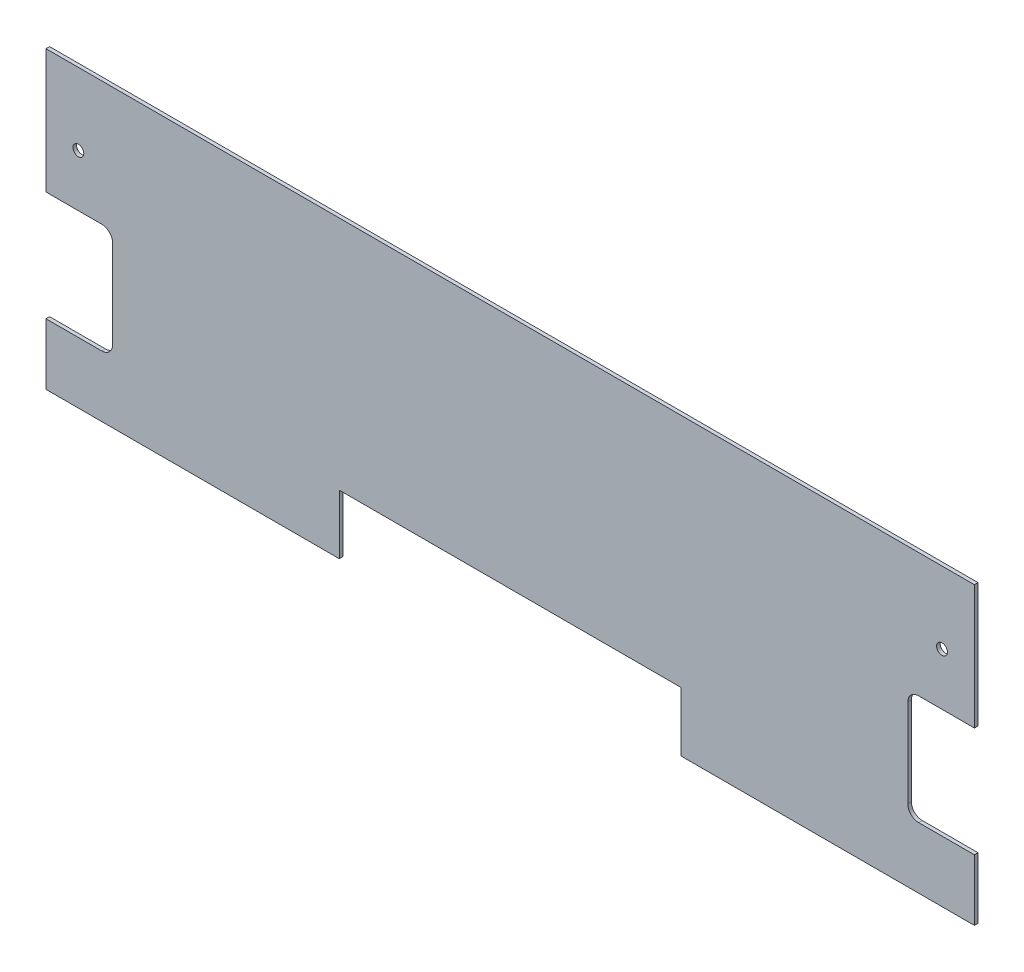
ISO-10303-21;
HEADER;
FILE_DESCRIPTION(('STEP AP214'),'2;1');
FILE_NAME('part.step','',(''),(''),'','','');
FILE_SCHEMA(('AUTOMOTIVE_DESIGN { 1 0 10303 214 1 1 1 1 }'));
ENDSEC;
DATA;
#1=APPLICATION_CONTEXT('core data for automotive mechanical design processes');
#2=APPLICATION_PROTOCOL_DEFINITION('international standard','automotive_design',2000,#1);
#3=PRODUCT_CONTEXT('',#1,'mechanical');
#4=PRODUCT('Part','Part','',(#3));
#5=PRODUCT_RELATED_PRODUCT_CATEGORY('part','',(#4));
#6=PRODUCT_DEFINITION_FORMATION('','',#4);
#7=PRODUCT_DEFINITION_CONTEXT('part definition',#1,'design');
#8=PRODUCT_DEFINITION('design','',#6,#7);
#9=PRODUCT_DEFINITION_SHAPE('','',#8);
#10=(LENGTH_UNIT() NAMED_UNIT(*) SI_UNIT(.MILLI.,.METRE.));
#11=(NAMED_UNIT(*) PLANE_ANGLE_UNIT() SI_UNIT($,.RADIAN.));
#12=(NAMED_UNIT(*) SI_UNIT($,.STERADIAN.) SOLID_ANGLE_UNIT());
#13=UNCERTAINTY_MEASURE_WITH_UNIT(LENGTH_MEASURE(1.E-05),#10,'distance_accuracy_value','');
#14=(GEOMETRIC_REPRESENTATION_CONTEXT(3) GLOBAL_UNCERTAINTY_ASSIGNED_CONTEXT((#13)) GLOBAL_UNIT_ASSIGNED_CONTEXT((#10,
#11,#12)) REPRESENTATION_CONTEXT('',''));
#15=CARTESIAN_POINT('',(0.,0.,0.));
#16=DIRECTION('',(0.,0.,1.));
#17=DIRECTION('',(1.,0.,0.));
#18=AXIS2_PLACEMENT_3D('',#15,#16,#17);
#19=CARTESIAN_POINT('',(-129.,-82.,-1.));
#20=DIRECTION('',(-1.,0.,0.));
#21=DIRECTION('',(0.,0.,1.));
#22=AXIS2_PLACEMENT_3D('',#19,#20,#21);
#23=PLANE('',#22);
#24=DIRECTION('',(0.,0.,1.));
#25=VECTOR('',#24,1.);
#26=CARTESIAN_POINT('',(-129.,-34.5,-1.));
#27=LINE('',#26,#25);
#28=CARTESIAN_POINT('',(-129.,-34.5,-1.));
#29=VERTEX_POINT('',#28);
#30=CARTESIAN_POINT('',(-129.,-34.5,0.));
#31=VERTEX_POINT('',#30);
#32=EDGE_CURVE('E303',#29,#31,#27,.T.);
#33=ORIENTED_EDGE('',*,*,#32,.T.);
#34=DIRECTION('',(0.,-1.,0.));
#35=VECTOR('',#34,1.);
#36=CARTESIAN_POINT('',(-129.,-82.,0.));
#37=LINE('',#36,#35);
#38=CARTESIAN_POINT('',(-129.,0.,0.));
#39=VERTEX_POINT('',#38);
#40=EDGE_CURVE('E214',#39,#31,#37,.T.);
#41=ORIENTED_EDGE('',*,*,#40,.F.);
#42=DIRECTION('',(0.,0.,1.));
#43=VECTOR('',#42,1.);
#44=CARTESIAN_POINT('',(-129.,0.,-1.));
#45=LINE('',#44,#43);
#46=CARTESIAN_POINT('',(-129.,0.,-1.));
#47=VERTEX_POINT('',#46);
#48=EDGE_CURVE('E240',#47,#39,#45,.T.);
#49=ORIENTED_EDGE('',*,*,#48,.F.);
#50=DIRECTION('',(0.,-1.,0.));
#51=VECTOR('',#50,1.);
#52=CARTESIAN_POINT('',(-129.,-82.,-1.));
#53=LINE('',#52,#51);
#54=EDGE_CURVE('E317',#47,#29,#53,.T.);
#55=ORIENTED_EDGE('',*,*,#54,.T.);
#56=EDGE_LOOP('',(#33,#41,#49,#55));
#57=FACE_BOUND('',#56,.T.);
#58=ADVANCED_FACE('F38',(#57),#23,.T.);
#59=CARTESIAN_POINT('',(129.,-82.,-1.));
#60=DIRECTION('',(1.,0.,0.));
#61=DIRECTION('',(0.,0.,-1.));
#62=AXIS2_PLACEMENT_3D('',#59,#60,#61);
#63=PLANE('',#62);
#64=DIRECTION('',(0.,0.,1.));
#65=VECTOR('',#64,1.);
#66=CARTESIAN_POINT('',(129.,-65.,-1.));
#67=LINE('',#66,#65);
#68=CARTESIAN_POINT('',(129.,-65.,-1.));
#69=VERTEX_POINT('',#68);
#70=CARTESIAN_POINT('',(129.,-65.,0.));
#71=VERTEX_POINT('',#70);
#72=EDGE_CURVE('E193',#69,#71,#67,.T.);
#73=ORIENTED_EDGE('',*,*,#72,.T.);
#74=DIRECTION('',(0.,1.,0.));
#75=VECTOR('',#74,1.);
#76=CARTESIAN_POINT('',(129.,-82.,0.));
#77=LINE('',#76,#75);
#78=CARTESIAN_POINT('',(129.,-82.,0.));
#79=VERTEX_POINT('',#78);
#80=EDGE_CURVE('E233',#79,#71,#77,.T.);
#81=ORIENTED_EDGE('',*,*,#80,.F.);
#82=DIRECTION('',(0.,0.,1.));
#83=VECTOR('',#82,1.);
#84=CARTESIAN_POINT('',(129.,-82.,-1.));
#85=LINE('',#84,#83);
#86=CARTESIAN_POINT('',(129.,-82.,-1.));
#87=VERTEX_POINT('',#86);
#88=EDGE_CURVE('E245',#87,#79,#85,.T.);
#89=ORIENTED_EDGE('',*,*,#88,.F.);
#90=DIRECTION('',(0.,1.,0.));
#91=VECTOR('',#90,1.);
#92=CARTESIAN_POINT('',(129.,-82.,-1.));
#93=LINE('',#92,#91);
#94=EDGE_CURVE('E203',#87,#69,#93,.T.);
#95=ORIENTED_EDGE('',*,*,#94,.T.);
#96=EDGE_LOOP('',(#73,#81,#89,#95));
#97=FACE_BOUND('',#96,.T.);
#98=ADVANCED_FACE('F374',(#97),#63,.T.);
#99=DIRECTION('',(0.,0.,1.));
#100=VECTOR('',#99,1.);
#101=CARTESIAN_POINT('',(-129.,-65.,-1.));
#102=LINE('',#101,#100);
#103=CARTESIAN_POINT('',(-129.,-65.,-1.));
#104=VERTEX_POINT('',#103);
#105=CARTESIAN_POINT('',(-129.,-65.,0.));
#106=VERTEX_POINT('',#105);
#107=EDGE_CURVE('E305',#104,#106,#102,.T.);
#108=ORIENTED_EDGE('',*,*,#107,.F.);
#109=CARTESIAN_POINT('',(-129.,-82.,-1.));
#110=VERTEX_POINT('',#109);
#111=EDGE_CURVE('E239',#104,#110,#53,.T.);
#112=ORIENTED_EDGE('',*,*,#111,.T.);
#113=DIRECTION('',(0.,0.,1.));
#114=VECTOR('',#113,1.);
#115=CARTESIAN_POINT('',(-129.,-82.,-1.));
#116=LINE('',#115,#114);
#117=CARTESIAN_POINT('',(-129.,-82.,0.));
#118=VERTEX_POINT('',#117);
#119=EDGE_CURVE('E213',#110,#118,#116,.T.);
#120=ORIENTED_EDGE('',*,*,#119,.T.);
#121=EDGE_CURVE('E218',#106,#118,#37,.T.);
#122=ORIENTED_EDGE('',*,*,#121,.F.);
#123=EDGE_LOOP('',(#108,#112,#120,#122));
#124=FACE_BOUND('',#123,.T.);
#125=ADVANCED_FACE('F352',(#124),#23,.T.);
#126=CARTESIAN_POINT('',(-129.,0.,-1.));
#127=DIRECTION('',(0.,1.,0.));
#128=DIRECTION('',(0.,0.,1.));
#129=AXIS2_PLACEMENT_3D('',#126,#127,#128);
#130=PLANE('',#129);
#131=DIRECTION('',(-1.,0.,0.));
#132=VECTOR('',#131,1.);
#133=CARTESIAN_POINT('',(-129.,0.,0.));
#134=LINE('',#133,#132);
#135=CARTESIAN_POINT('',(129.,0.,0.));
#136=VERTEX_POINT('',#135);
#137=EDGE_CURVE('E236',#136,#39,#134,.T.);
#138=ORIENTED_EDGE('',*,*,#137,.F.);
#139=DIRECTION('',(0.,0.,1.));
#140=VECTOR('',#139,1.);
#141=CARTESIAN_POINT('',(129.,0.,-1.));
#142=LINE('',#141,#140);
#143=CARTESIAN_POINT('',(129.,0.,-1.));
#144=VERTEX_POINT('',#143);
#145=EDGE_CURVE('E243',#144,#136,#142,.T.);
#146=ORIENTED_EDGE('',*,*,#145,.F.);
#147=DIRECTION('',(-1.,0.,0.));
#148=VECTOR('',#147,1.);
#149=CARTESIAN_POINT('',(-129.,0.,-1.));
#150=LINE('',#149,#148);
#151=EDGE_CURVE('E202',#144,#47,#150,.T.);
#152=ORIENTED_EDGE('',*,*,#151,.T.);
#153=ORIENTED_EDGE('',*,*,#48,.T.);
#154=EDGE_LOOP('',(#138,#146,#152,#153));
#155=FACE_BOUND('',#154,.T.);
#156=ADVANCED_FACE('F385',(#155),#130,.T.);
#157=DIRECTION('',(0.,0.,1.));
#158=VECTOR('',#157,1.);
#159=CARTESIAN_POINT('',(129.,-34.5,-1.));
#160=LINE('',#159,#158);
#161=CARTESIAN_POINT('',(129.,-34.5,-1.));
#162=VERTEX_POINT('',#161);
#163=CARTESIAN_POINT('',(129.,-34.5,0.));
#164=VERTEX_POINT('',#163);
#165=EDGE_CURVE('E177',#162,#164,#160,.T.);
#166=ORIENTED_EDGE('',*,*,#165,.F.);
#167=EDGE_CURVE('E190',#162,#144,#93,.T.);
#168=ORIENTED_EDGE('',*,*,#167,.T.);
#169=ORIENTED_EDGE('',*,*,#145,.T.);
#170=EDGE_CURVE('E192',#164,#136,#77,.T.);
#171=ORIENTED_EDGE('',*,*,#170,.F.);
#172=EDGE_LOOP('',(#166,#168,#169,#171));
#173=FACE_BOUND('',#172,.T.);
#174=ADVANCED_FACE('F188',(#173),#63,.T.);
#175=CARTESIAN_POINT('',(47.5,-82.,-1.));
#176=DIRECTION('',(0.,-1.,0.));
#177=DIRECTION('',(0.,0.,-1.));
#178=AXIS2_PLACEMENT_3D('',#175,#176,#177);
#179=PLANE('',#178);
#180=DIRECTION('',(1.,0.,0.));
#181=VECTOR('',#180,1.);
#182=CARTESIAN_POINT('',(47.5,-82.,0.));
#183=LINE('',#182,#181);
#184=CARTESIAN_POINT('',(47.5,-82.,0.));
#185=VERTEX_POINT('',#184);
#186=EDGE_CURVE('E230',#185,#79,#183,.T.);
#187=ORIENTED_EDGE('',*,*,#186,.F.);
#188=DIRECTION('',(0.,0.,1.));
#189=VECTOR('',#188,1.);
#190=CARTESIAN_POINT('',(47.5,-82.,-1.));
#191=LINE('',#190,#189);
#192=CARTESIAN_POINT('',(47.5,-82.,-1.));
#193=VERTEX_POINT('',#192);
#194=EDGE_CURVE('E247',#193,#185,#191,.T.);
#195=ORIENTED_EDGE('',*,*,#194,.F.);
#196=DIRECTION('',(1.,0.,0.));
#197=VECTOR('',#196,1.);
#198=CARTESIAN_POINT('',(47.5,-82.,-1.));
#199=LINE('',#198,#197);
#200=EDGE_CURVE('E204',#193,#87,#199,.T.);
#201=ORIENTED_EDGE('',*,*,#200,.T.);
#202=ORIENTED_EDGE('',*,*,#88,.T.);
#203=EDGE_LOOP('',(#187,#195,#201,#202));
#204=FACE_BOUND('',#203,.T.);
#205=ADVANCED_FACE('F394',(#204),#179,.T.);
#206=CARTESIAN_POINT('',(47.5,-82.,-1.));
#207=DIRECTION('',(-1.,0.,0.));
#208=DIRECTION('',(0.,0.,1.));
#209=AXIS2_PLACEMENT_3D('',#206,#207,#208);
#210=PLANE('',#209);
#211=DIRECTION('',(0.,-1.,0.));
#212=VECTOR('',#211,1.);
#213=CARTESIAN_POINT('',(47.5,-82.,0.));
#214=LINE('',#213,#212);
#215=CARTESIAN_POINT('',(47.5,-65.5,0.));
#216=VERTEX_POINT('',#215);
#217=EDGE_CURVE('E227',#216,#185,#214,.T.);
#218=ORIENTED_EDGE('',*,*,#217,.F.);
#219=DIRECTION('',(0.,0.,1.));
#220=VECTOR('',#219,1.);
#221=CARTESIAN_POINT('',(47.5,-65.5,-1.));
#222=LINE('',#221,#220);
#223=CARTESIAN_POINT('',(47.5,-65.5,-1.));
#224=VERTEX_POINT('',#223);
#225=EDGE_CURVE('E249',#224,#216,#222,.T.);
#226=ORIENTED_EDGE('',*,*,#225,.F.);
#227=DIRECTION('',(0.,-1.,0.));
#228=VECTOR('',#227,1.);
#229=CARTESIAN_POINT('',(47.5,-82.,-1.));
#230=LINE('',#229,#228);
#231=EDGE_CURVE('E208',#224,#193,#230,.T.);
#232=ORIENTED_EDGE('',*,*,#231,.T.);
#233=ORIENTED_EDGE('',*,*,#194,.T.);
#234=EDGE_LOOP('',(#218,#226,#232,#233));
#235=FACE_BOUND('',#234,.T.);
#236=ADVANCED_FACE('F331',(#235),#210,.T.);
#237=CARTESIAN_POINT('',(-47.5,-65.5,-1.));
#238=DIRECTION('',(0.,-1.,0.));
#239=DIRECTION('',(0.,0.,-1.));
#240=AXIS2_PLACEMENT_3D('',#237,#238,#239);
#241=PLANE('',#240);
#242=DIRECTION('',(1.,0.,0.));
#243=VECTOR('',#242,1.);
#244=CARTESIAN_POINT('',(-47.5,-65.5,0.));
#245=LINE('',#244,#243);
#246=CARTESIAN_POINT('',(-47.5,-65.5,0.));
#247=VERTEX_POINT('',#246);
#248=EDGE_CURVE('E224',#247,#216,#245,.T.);
#249=ORIENTED_EDGE('',*,*,#248,.F.);
#250=DIRECTION('',(0.,0.,1.));
#251=VECTOR('',#250,1.);
#252=CARTESIAN_POINT('',(-47.5,-65.5,-1.));
#253=LINE('',#252,#251);
#254=CARTESIAN_POINT('',(-47.5,-65.5,-1.));
#255=VERTEX_POINT('',#254);
#256=EDGE_CURVE('E251',#255,#247,#253,.T.);
#257=ORIENTED_EDGE('',*,*,#256,.F.);
#258=DIRECTION('',(1.,0.,0.));
#259=VECTOR('',#258,1.);
#260=CARTESIAN_POINT('',(-47.5,-65.5,-1.));
#261=LINE('',#260,#259);
#262=EDGE_CURVE('E325',#255,#224,#261,.T.);
#263=ORIENTED_EDGE('',*,*,#262,.T.);
#264=ORIENTED_EDGE('',*,*,#225,.T.);
#265=EDGE_LOOP('',(#249,#257,#263,#264));
#266=FACE_BOUND('',#265,.T.);
#267=ADVANCED_FACE('F339',(#266),#241,.T.);
#268=CARTESIAN_POINT('',(-47.5,-82.,-1.));
#269=DIRECTION('',(1.,0.,0.));
#270=DIRECTION('',(0.,0.,-1.));
#271=AXIS2_PLACEMENT_3D('',#268,#269,#270);
#272=PLANE('',#271);
#273=DIRECTION('',(0.,1.,0.));
#274=VECTOR('',#273,1.);
#275=CARTESIAN_POINT('',(-47.5,-82.,0.));
#276=LINE('',#275,#274);
#277=CARTESIAN_POINT('',(-47.5,-82.,0.));
#278=VERTEX_POINT('',#277);
#279=EDGE_CURVE('E221',#278,#247,#276,.T.);
#280=ORIENTED_EDGE('',*,*,#279,.F.);
#281=DIRECTION('',(0.,0.,1.));
#282=VECTOR('',#281,1.);
#283=CARTESIAN_POINT('',(-47.5,-82.,-1.));
#284=LINE('',#283,#282);
#285=CARTESIAN_POINT('',(-47.5,-82.,-1.));
#286=VERTEX_POINT('',#285);
#287=EDGE_CURVE('E253',#286,#278,#284,.T.);
#288=ORIENTED_EDGE('',*,*,#287,.F.);
#289=DIRECTION('',(0.,1.,0.));
#290=VECTOR('',#289,1.);
#291=CARTESIAN_POINT('',(-47.5,-82.,-1.));
#292=LINE('',#291,#290);
#293=EDGE_CURVE('E322',#286,#255,#292,.T.);
#294=ORIENTED_EDGE('',*,*,#293,.T.);
#295=ORIENTED_EDGE('',*,*,#256,.T.);
#296=EDGE_LOOP('',(#280,#288,#294,#295));
#297=FACE_BOUND('',#296,.T.);
#298=ADVANCED_FACE('F342',(#297),#272,.T.);
#299=CARTESIAN_POINT('',(-129.,-82.,-1.));
#300=DIRECTION('',(0.,-1.,0.));
#301=DIRECTION('',(0.,0.,-1.));
#302=AXIS2_PLACEMENT_3D('',#299,#300,#301);
#303=PLANE('',#302);
#304=DIRECTION('',(1.,0.,0.));
#305=VECTOR('',#304,1.);
#306=CARTESIAN_POINT('',(-129.,-82.,0.));
#307=LINE('',#306,#305);
#308=EDGE_CURVE('E217',#118,#278,#307,.T.);
#309=ORIENTED_EDGE('',*,*,#308,.F.);
#310=ORIENTED_EDGE('',*,*,#119,.F.);
#311=DIRECTION('',(1.,0.,0.));
#312=VECTOR('',#311,1.);
#313=CARTESIAN_POINT('',(-129.,-82.,-1.));
#314=LINE('',#313,#312);
#315=EDGE_CURVE('E319',#110,#286,#314,.T.);
#316=ORIENTED_EDGE('',*,*,#315,.T.);
#317=ORIENTED_EDGE('',*,*,#287,.T.);
#318=EDGE_LOOP('',(#309,#310,#316,#317));
#319=FACE_BOUND('',#318,.T.);
#320=ADVANCED_FACE('F348',(#319),#303,.T.);
#321=CARTESIAN_POINT('',(0.,0.,-1.));
#322=DIRECTION('',(0.,0.,-1.));
#323=DIRECTION('',(-1.,0.,0.));
#324=AXIS2_PLACEMENT_3D('',#321,#322,#323);
#325=PLANE('',#324);
#326=DIRECTION('',(0.,-1.,0.));
#327=VECTOR('',#326,1.);
#328=CARTESIAN_POINT('',(110.5,-34.5,-1.));
#329=LINE('',#328,#327);
#330=CARTESIAN_POINT('',(110.5,-37.5,-1.));
#331=VERTEX_POINT('',#330);
#332=CARTESIAN_POINT('',(110.5,-62.,-1.));
#333=VERTEX_POINT('',#332);
#334=EDGE_CURVE('E183',#331,#333,#329,.T.);
#335=ORIENTED_EDGE('',*,*,#334,.T.);
#336=CARTESIAN_POINT('',(113.5,-62.,-1.));
#337=DIRECTION('',(0.,0.,-1.));
#338=DIRECTION('',(-1.,0.,0.));
#339=AXIS2_PLACEMENT_3D('',#336,#337,#338);
#340=CIRCLE('',#339,3.);
#341=CARTESIAN_POINT('',(113.5,-65.,-1.));
#342=VERTEX_POINT('',#341);
#343=EDGE_CURVE('E280',#333,#342,#340,.F.);
#344=ORIENTED_EDGE('',*,*,#343,.T.);
#345=DIRECTION('',(1.,0.,0.));
#346=VECTOR('',#345,1.);
#347=CARTESIAN_POINT('',(129.,-65.,-1.));
#348=LINE('',#347,#346);
#349=EDGE_CURVE('E194',#342,#69,#348,.T.);
#350=ORIENTED_EDGE('',*,*,#349,.T.);
#351=ORIENTED_EDGE('',*,*,#94,.F.);
#352=ORIENTED_EDGE('',*,*,#200,.F.);
#353=ORIENTED_EDGE('',*,*,#231,.F.);
#354=ORIENTED_EDGE('',*,*,#262,.F.);
#355=ORIENTED_EDGE('',*,*,#293,.F.);
#356=ORIENTED_EDGE('',*,*,#315,.F.);
#357=ORIENTED_EDGE('',*,*,#111,.F.);
#358=DIRECTION('',(1.,0.,0.));
#359=VECTOR('',#358,1.);
#360=CARTESIAN_POINT('',(-129.,-65.,-1.));
#361=LINE('',#360,#359);
#362=CARTESIAN_POINT('',(-113.5,-65.,-1.));
#363=VERTEX_POINT('',#362);
#364=EDGE_CURVE('E309',#104,#363,#361,.T.);
#365=ORIENTED_EDGE('',*,*,#364,.T.);
#366=CARTESIAN_POINT('',(-113.5,-62.,-1.));
#367=DIRECTION('',(0.,0.,-1.));
#368=DIRECTION('',(-1.,0.,0.));
#369=AXIS2_PLACEMENT_3D('',#366,#367,#368);
#370=CIRCLE('',#369,3.);
#371=CARTESIAN_POINT('',(-110.5,-62.,-1.));
#372=VERTEX_POINT('',#371);
#373=EDGE_CURVE('E284',#363,#372,#370,.F.);
#374=ORIENTED_EDGE('',*,*,#373,.T.);
#375=DIRECTION('',(0.,1.,0.));
#376=VECTOR('',#375,1.);
#377=CARTESIAN_POINT('',(-110.5,-34.5,-1.));
#378=LINE('',#377,#376);
#379=CARTESIAN_POINT('',(-110.5,-37.5,-1.));
#380=VERTEX_POINT('',#379);
#381=EDGE_CURVE('E306',#372,#380,#378,.T.);
#382=ORIENTED_EDGE('',*,*,#381,.T.);
#383=CARTESIAN_POINT('',(-113.5,-37.5,-1.));
#384=DIRECTION('',(0.,0.,-1.));
#385=DIRECTION('',(-1.,0.,0.));
#386=AXIS2_PLACEMENT_3D('',#383,#384,#385);
#387=CIRCLE('',#386,3.);
#388=CARTESIAN_POINT('',(-113.5,-34.5,-1.));
#389=VERTEX_POINT('',#388);
#390=EDGE_CURVE('E11',#380,#389,#387,.F.);
#391=ORIENTED_EDGE('',*,*,#390,.T.);
#392=DIRECTION('',(-1.,0.,0.));
#393=VECTOR('',#392,1.);
#394=CARTESIAN_POINT('',(-129.,-34.5,-1.));
#395=LINE('',#394,#393);
#396=EDGE_CURVE('E302',#389,#29,#395,.T.);
#397=ORIENTED_EDGE('',*,*,#396,.T.);
#398=ORIENTED_EDGE('',*,*,#54,.F.);
#399=ORIENTED_EDGE('',*,*,#151,.F.);
#400=ORIENTED_EDGE('',*,*,#167,.F.);
#401=DIRECTION('',(-1.,0.,0.));
#402=VECTOR('',#401,1.);
#403=CARTESIAN_POINT('',(129.,-34.5,-1.));
#404=LINE('',#403,#402);
#405=CARTESIAN_POINT('',(113.5,-34.5,-1.));
#406=VERTEX_POINT('',#405);
#407=EDGE_CURVE('E173',#162,#406,#404,.T.);
#408=ORIENTED_EDGE('',*,*,#407,.T.);
#409=CARTESIAN_POINT('',(113.5,-37.5,-1.));
#410=DIRECTION('',(0.,0.,-1.));
#411=DIRECTION('',(-1.,0.,0.));
#412=AXIS2_PLACEMENT_3D('',#409,#410,#411);
#413=CIRCLE('',#412,3.);
#414=EDGE_CURVE('E276',#406,#331,#413,.F.);
#415=ORIENTED_EDGE('',*,*,#414,.T.);
#416=EDGE_LOOP('',(#335,#344,#350,#351,#352,#353,#354,#355,#356,#357,#365,#374,#382,#391,#397,
#398,#399,#400,#408,#415));
#417=FACE_BOUND('',#416,.T.);
#418=CARTESIAN_POINT('',(-120.,-20.,-1.));
#419=DIRECTION('',(0.,0.,1.));
#420=DIRECTION('',(1.,0.,0.));
#421=AXIS2_PLACEMENT_3D('',#418,#419,#420);
#422=CIRCLE('',#421,1.5);
#423=CARTESIAN_POINT('',(-118.5,-20.,-1.));
#424=VERTEX_POINT('',#423);
#425=EDGE_CURVE('E436',#424,#424,#422,.T.);
#426=ORIENTED_EDGE('',*,*,#425,.T.);
#427=EDGE_LOOP('',(#426));
#428=FACE_BOUND('',#427,.T.);
#429=CARTESIAN_POINT('',(120.,-20.,-1.));
#430=DIRECTION('',(0.,0.,1.));
#431=DIRECTION('',(-1.,0.,0.));
#432=AXIS2_PLACEMENT_3D('',#429,#430,#431);
#433=CIRCLE('',#432,1.5);
#434=CARTESIAN_POINT('',(118.5,-20.,-1.));
#435=VERTEX_POINT('',#434);
#436=EDGE_CURVE('E426',#435,#435,#433,.T.);
#437=ORIENTED_EDGE('',*,*,#436,.T.);
#438=EDGE_LOOP('',(#437));
#439=FACE_BOUND('',#438,.T.);
#440=ADVANCED_FACE('F198',(#417,#428,#439),#325,.T.);
#441=CARTESIAN_POINT('',(0.,0.,0.));
#442=DIRECTION('',(0.,0.,-1.));
#443=DIRECTION('',(-1.,0.,0.));
#444=AXIS2_PLACEMENT_3D('',#441,#442,#443);
#445=PLANE('',#444);
#446=CARTESIAN_POINT('',(-120.,-20.,0.));
#447=DIRECTION('',(0.,0.,1.));
#448=DIRECTION('',(1.,0.,0.));
#449=AXIS2_PLACEMENT_3D('',#446,#447,#448);
#450=CIRCLE('',#449,1.5);
#451=CARTESIAN_POINT('',(-118.5,-20.,0.));
#452=VERTEX_POINT('',#451);
#453=EDGE_CURVE('E421',#452,#452,#450,.T.);
#454=ORIENTED_EDGE('',*,*,#453,.F.);
#455=EDGE_LOOP('',(#454));
#456=FACE_BOUND('',#455,.T.);
#457=CARTESIAN_POINT('',(120.,-20.,0.));
#458=DIRECTION('',(0.,0.,1.));
#459=DIRECTION('',(-1.,0.,0.));
#460=AXIS2_PLACEMENT_3D('',#457,#458,#459);
#461=CIRCLE('',#460,1.5);
#462=CARTESIAN_POINT('',(118.5,-20.,0.));
#463=VERTEX_POINT('',#462);
#464=EDGE_CURVE('E424',#463,#463,#461,.T.);
#465=ORIENTED_EDGE('',*,*,#464,.F.);
#466=EDGE_LOOP('',(#465));
#467=FACE_BOUND('',#466,.T.);
#468=ORIENTED_EDGE('',*,*,#80,.T.);
#469=DIRECTION('',(1.,0.,0.));
#470=VECTOR('',#469,1.);
#471=CARTESIAN_POINT('',(129.,-65.,0.));
#472=LINE('',#471,#470);
#473=CARTESIAN_POINT('',(113.5,-65.,0.));
#474=VERTEX_POINT('',#473);
#475=EDGE_CURVE('E184',#474,#71,#472,.T.);
#476=ORIENTED_EDGE('',*,*,#475,.F.);
#477=CARTESIAN_POINT('',(113.5,-62.,0.));
#478=DIRECTION('',(0.,0.,-1.));
#479=DIRECTION('',(-1.,0.,0.));
#480=AXIS2_PLACEMENT_3D('',#477,#478,#479);
#481=CIRCLE('',#480,3.);
#482=CARTESIAN_POINT('',(110.5,-62.,0.));
#483=VERTEX_POINT('',#482);
#484=EDGE_CURVE('E278',#474,#483,#481,.T.);
#485=ORIENTED_EDGE('',*,*,#484,.T.);
#486=DIRECTION('',(0.,-1.,0.));
#487=VECTOR('',#486,1.);
#488=CARTESIAN_POINT('',(110.5,-34.5,0.));
#489=LINE('',#488,#487);
#490=CARTESIAN_POINT('',(110.5,-37.5,0.));
#491=VERTEX_POINT('',#490);
#492=EDGE_CURVE('E435',#491,#483,#489,.T.);
#493=ORIENTED_EDGE('',*,*,#492,.F.);
#494=CARTESIAN_POINT('',(113.5,-37.5,0.));
#495=DIRECTION('',(0.,0.,-1.));
#496=DIRECTION('',(-1.,0.,0.));
#497=AXIS2_PLACEMENT_3D('',#494,#495,#496);
#498=CIRCLE('',#497,3.);
#499=CARTESIAN_POINT('',(113.5,-34.5,0.));
#500=VERTEX_POINT('',#499);
#501=EDGE_CURVE('E274',#491,#500,#498,.T.);
#502=ORIENTED_EDGE('',*,*,#501,.T.);
#503=DIRECTION('',(-1.,0.,0.));
#504=VECTOR('',#503,1.);
#505=CARTESIAN_POINT('',(129.,-34.5,0.));
#506=LINE('',#505,#504);
#507=EDGE_CURVE('E433',#164,#500,#506,.T.);
#508=ORIENTED_EDGE('',*,*,#507,.F.);
#509=ORIENTED_EDGE('',*,*,#170,.T.);
#510=ORIENTED_EDGE('',*,*,#137,.T.);
#511=ORIENTED_EDGE('',*,*,#40,.T.);
#512=DIRECTION('',(-1.,0.,0.));
#513=VECTOR('',#512,1.);
#514=CARTESIAN_POINT('',(-129.,-34.5,0.));
#515=LINE('',#514,#513);
#516=CARTESIAN_POINT('',(-113.5,-34.5,0.));
#517=VERTEX_POINT('',#516);
#518=EDGE_CURVE('E291',#517,#31,#515,.T.);
#519=ORIENTED_EDGE('',*,*,#518,.F.);
#520=CARTESIAN_POINT('',(-113.5,-37.5,0.));
#521=DIRECTION('',(0.,0.,-1.));
#522=DIRECTION('',(-1.,0.,0.));
#523=AXIS2_PLACEMENT_3D('',#520,#521,#522);
#524=CIRCLE('',#523,3.);
#525=CARTESIAN_POINT('',(-110.5,-37.5,0.));
#526=VERTEX_POINT('',#525);
#527=EDGE_CURVE('E46',#517,#526,#524,.T.);
#528=ORIENTED_EDGE('',*,*,#527,.T.);
#529=DIRECTION('',(0.,1.,0.));
#530=VECTOR('',#529,1.);
#531=CARTESIAN_POINT('',(-110.5,-34.5,0.));
#532=LINE('',#531,#530);
#533=CARTESIAN_POINT('',(-110.5,-62.,0.));
#534=VERTEX_POINT('',#533);
#535=EDGE_CURVE('E290',#534,#526,#532,.T.);
#536=ORIENTED_EDGE('',*,*,#535,.F.);
#537=CARTESIAN_POINT('',(-113.5,-62.,0.));
#538=DIRECTION('',(0.,0.,-1.));
#539=DIRECTION('',(-1.,0.,0.));
#540=AXIS2_PLACEMENT_3D('',#537,#538,#539);
#541=CIRCLE('',#540,3.);
#542=CARTESIAN_POINT('',(-113.5,-65.,0.));
#543=VERTEX_POINT('',#542);
#544=EDGE_CURVE('E282',#534,#543,#541,.T.);
#545=ORIENTED_EDGE('',*,*,#544,.T.);
#546=DIRECTION('',(1.,0.,0.));
#547=VECTOR('',#546,1.);
#548=CARTESIAN_POINT('',(-129.,-65.,0.));
#549=LINE('',#548,#547);
#550=EDGE_CURVE('E296',#106,#543,#549,.T.);
#551=ORIENTED_EDGE('',*,*,#550,.F.);
#552=ORIENTED_EDGE('',*,*,#121,.T.);
#553=ORIENTED_EDGE('',*,*,#308,.T.);
#554=ORIENTED_EDGE('',*,*,#279,.T.);
#555=ORIENTED_EDGE('',*,*,#248,.T.);
#556=ORIENTED_EDGE('',*,*,#217,.T.);
#557=ORIENTED_EDGE('',*,*,#186,.T.);
#558=EDGE_LOOP('',(#468,#476,#485,#493,#502,#508,#509,#510,#511,#519,#528,#536,#545,#551,#552,
#553,#554,#555,#556,#557));
#559=FACE_BOUND('',#558,.T.);
#560=ADVANCED_FACE('F289',(#456,#467,#559),#445,.F.);
#561=CARTESIAN_POINT('',(-129.,-34.5,-1.));
#562=DIRECTION('',(0.,1.,0.));
#563=DIRECTION('',(0.,0.,1.));
#564=AXIS2_PLACEMENT_3D('',#561,#562,#563);
#565=PLANE('',#564);
#566=ORIENTED_EDGE('',*,*,#396,.F.);
#567=DIRECTION('',(0.,0.,1.));
#568=VECTOR('',#567,1.);
#569=CARTESIAN_POINT('',(-113.5,-34.5,0.));
#570=LINE('',#569,#568);
#571=EDGE_CURVE('E272',#389,#517,#570,.T.);
#572=ORIENTED_EDGE('',*,*,#571,.T.);
#573=ORIENTED_EDGE('',*,*,#518,.T.);
#574=ORIENTED_EDGE('',*,*,#32,.F.);
#575=EDGE_LOOP('',(#566,#572,#573,#574));
#576=FACE_BOUND('',#575,.T.);
#577=ADVANCED_FACE('F299',(#576),#565,.F.);
#578=CARTESIAN_POINT('',(-110.5,-34.5,-1.));
#579=DIRECTION('',(1.,0.,0.));
#580=DIRECTION('',(0.,0.,-1.));
#581=AXIS2_PLACEMENT_3D('',#578,#579,#580);
#582=PLANE('',#581);
#583=ORIENTED_EDGE('',*,*,#381,.F.);
#584=DIRECTION('',(0.,0.,1.));
#585=VECTOR('',#584,1.);
#586=CARTESIAN_POINT('',(-110.5,-62.,0.));
#587=LINE('',#586,#585);
#588=EDGE_CURVE('E267',#372,#534,#587,.T.);
#589=ORIENTED_EDGE('',*,*,#588,.T.);
#590=ORIENTED_EDGE('',*,*,#535,.T.);
#591=DIRECTION('',(0.,0.,1.));
#592=VECTOR('',#591,1.);
#593=CARTESIAN_POINT('',(-110.5,-37.5,-1.));
#594=LINE('',#593,#592);
#595=EDGE_CURVE('E265',#526,#380,#594,.F.);
#596=ORIENTED_EDGE('',*,*,#595,.T.);
#597=EDGE_LOOP('',(#583,#589,#590,#596));
#598=FACE_BOUND('',#597,.T.);
#599=ADVANCED_FACE('F294',(#598),#582,.F.);
#600=CARTESIAN_POINT('',(-129.,-65.,-1.));
#601=DIRECTION('',(0.,-1.,0.));
#602=DIRECTION('',(0.,0.,-1.));
#603=AXIS2_PLACEMENT_3D('',#600,#601,#602);
#604=PLANE('',#603);
#605=ORIENTED_EDGE('',*,*,#550,.T.);
#606=DIRECTION('',(0.,0.,1.));
#607=VECTOR('',#606,1.);
#608=CARTESIAN_POINT('',(-113.5,-65.,-1.));
#609=LINE('',#608,#607);
#610=EDGE_CURVE('E270',#543,#363,#609,.F.);
#611=ORIENTED_EDGE('',*,*,#610,.T.);
#612=ORIENTED_EDGE('',*,*,#364,.F.);
#613=ORIENTED_EDGE('',*,*,#107,.T.);
#614=EDGE_LOOP('',(#605,#611,#612,#613));
#615=FACE_BOUND('',#614,.T.);
#616=ADVANCED_FACE('F360',(#615),#604,.F.);
#617=CARTESIAN_POINT('',(120.,-20.,-1.));
#618=DIRECTION('',(0.,0.,1.));
#619=DIRECTION('',(1.,0.,0.));
#620=AXIS2_PLACEMENT_3D('',#617,#618,#619);
#621=CYLINDRICAL_SURFACE('',#620,1.5);
#622=ORIENTED_EDGE('',*,*,#436,.F.);
#623=EDGE_LOOP('',(#622));
#624=FACE_BOUND('',#623,.T.);
#625=ORIENTED_EDGE('',*,*,#464,.T.);
#626=EDGE_LOOP('',(#625));
#627=FACE_BOUND('',#626,.T.);
#628=ADVANCED_FACE('F362',(#624,#627),#621,.F.);
#629=CARTESIAN_POINT('',(-120.,-20.,-1.));
#630=DIRECTION('',(0.,0.,1.));
#631=DIRECTION('',(1.,0.,0.));
#632=AXIS2_PLACEMENT_3D('',#629,#630,#631);
#633=CYLINDRICAL_SURFACE('',#632,1.5);
#634=ORIENTED_EDGE('',*,*,#425,.F.);
#635=EDGE_LOOP('',(#634));
#636=FACE_BOUND('',#635,.T.);
#637=ORIENTED_EDGE('',*,*,#453,.T.);
#638=EDGE_LOOP('',(#637));
#639=FACE_BOUND('',#638,.T.);
#640=ADVANCED_FACE('F368',(#636,#639),#633,.F.);
#641=CARTESIAN_POINT('',(129.,-65.,-1.));
#642=DIRECTION('',(0.,-1.,0.));
#643=DIRECTION('',(0.,0.,-1.));
#644=AXIS2_PLACEMENT_3D('',#641,#642,#643);
#645=PLANE('',#644);
#646=ORIENTED_EDGE('',*,*,#349,.F.);
#647=DIRECTION('',(0.,0.,1.));
#648=VECTOR('',#647,1.);
#649=CARTESIAN_POINT('',(113.5,-65.,0.));
#650=LINE('',#649,#648);
#651=EDGE_CURVE('E262',#342,#474,#650,.T.);
#652=ORIENTED_EDGE('',*,*,#651,.T.);
#653=ORIENTED_EDGE('',*,*,#475,.T.);
#654=ORIENTED_EDGE('',*,*,#72,.F.);
#655=EDGE_LOOP('',(#646,#652,#653,#654));
#656=FACE_BOUND('',#655,.T.);
#657=ADVANCED_FACE('F446',(#656),#645,.F.);
#658=CARTESIAN_POINT('',(110.5,-34.5,-1.));
#659=DIRECTION('',(-1.,0.,0.));
#660=DIRECTION('',(0.,0.,1.));
#661=AXIS2_PLACEMENT_3D('',#658,#659,#660);
#662=PLANE('',#661);
#663=ORIENTED_EDGE('',*,*,#334,.F.);
#664=DIRECTION('',(0.,0.,1.));
#665=VECTOR('',#664,1.);
#666=CARTESIAN_POINT('',(110.5,-37.5,0.));
#667=LINE('',#666,#665);
#668=EDGE_CURVE('E258',#331,#491,#667,.T.);
#669=ORIENTED_EDGE('',*,*,#668,.T.);
#670=ORIENTED_EDGE('',*,*,#492,.T.);
#671=DIRECTION('',(0.,0.,1.));
#672=VECTOR('',#671,1.);
#673=CARTESIAN_POINT('',(110.5,-62.,-1.));
#674=LINE('',#673,#672);
#675=EDGE_CURVE('E242',#483,#333,#674,.F.);
#676=ORIENTED_EDGE('',*,*,#675,.T.);
#677=EDGE_LOOP('',(#663,#669,#670,#676));
#678=FACE_BOUND('',#677,.T.);
#679=ADVANCED_FACE('F452',(#678),#662,.F.);
#680=CARTESIAN_POINT('',(129.,-34.5,-1.));
#681=DIRECTION('',(0.,1.,0.));
#682=DIRECTION('',(0.,0.,1.));
#683=AXIS2_PLACEMENT_3D('',#680,#681,#682);
#684=PLANE('',#683);
#685=ORIENTED_EDGE('',*,*,#507,.T.);
#686=DIRECTION('',(0.,0.,1.));
#687=VECTOR('',#686,1.);
#688=CARTESIAN_POINT('',(113.5,-34.5,-1.));
#689=LINE('',#688,#687);
#690=EDGE_CURVE('E180',#500,#406,#689,.F.);
#691=ORIENTED_EDGE('',*,*,#690,.T.);
#692=ORIENTED_EDGE('',*,*,#407,.F.);
#693=ORIENTED_EDGE('',*,*,#165,.T.);
#694=EDGE_LOOP('',(#685,#691,#692,#693));
#695=FACE_BOUND('',#694,.T.);
#696=ADVANCED_FACE('F176',(#695),#684,.F.);
#697=CARTESIAN_POINT('',(113.5,-37.5,-1.));
#698=DIRECTION('',(0.,0.,-1.));
#699=DIRECTION('',(-1.,0.,0.));
#700=AXIS2_PLACEMENT_3D('',#697,#698,#699);
#701=CYLINDRICAL_SURFACE('',#700,3.);
#702=ORIENTED_EDGE('',*,*,#414,.F.);
#703=ORIENTED_EDGE('',*,*,#690,.F.);
#704=ORIENTED_EDGE('',*,*,#501,.F.);
#705=ORIENTED_EDGE('',*,*,#668,.F.);
#706=EDGE_LOOP('',(#702,#703,#704,#705));
#707=FACE_BOUND('',#706,.T.);
#708=ADVANCED_FACE('F459',(#707),#701,.F.);
#709=CARTESIAN_POINT('',(113.5,-62.,-1.));
#710=DIRECTION('',(0.,0.,-1.));
#711=DIRECTION('',(-1.,0.,0.));
#712=AXIS2_PLACEMENT_3D('',#709,#710,#711);
#713=CYLINDRICAL_SURFACE('',#712,3.);
#714=ORIENTED_EDGE('',*,*,#343,.F.);
#715=ORIENTED_EDGE('',*,*,#675,.F.);
#716=ORIENTED_EDGE('',*,*,#484,.F.);
#717=ORIENTED_EDGE('',*,*,#651,.F.);
#718=EDGE_LOOP('',(#714,#715,#716,#717));
#719=FACE_BOUND('',#718,.T.);
#720=ADVANCED_FACE('F472',(#719),#713,.F.);
#721=CARTESIAN_POINT('',(-113.5,-62.,-1.));
#722=DIRECTION('',(0.,0.,-1.));
#723=DIRECTION('',(-1.,0.,0.));
#724=AXIS2_PLACEMENT_3D('',#721,#722,#723);
#725=CYLINDRICAL_SURFACE('',#724,3.);
#726=ORIENTED_EDGE('',*,*,#373,.F.);
#727=ORIENTED_EDGE('',*,*,#610,.F.);
#728=ORIENTED_EDGE('',*,*,#544,.F.);
#729=ORIENTED_EDGE('',*,*,#588,.F.);
#730=EDGE_LOOP('',(#726,#727,#728,#729));
#731=FACE_BOUND('',#730,.T.);
#732=ADVANCED_FACE('F358',(#731),#725,.F.);
#733=CARTESIAN_POINT('',(-113.5,-37.5,-1.));
#734=DIRECTION('',(0.,0.,-1.));
#735=DIRECTION('',(-1.,0.,0.));
#736=AXIS2_PLACEMENT_3D('',#733,#734,#735);
#737=CYLINDRICAL_SURFACE('',#736,3.);
#738=ORIENTED_EDGE('',*,*,#390,.F.);
#739=ORIENTED_EDGE('',*,*,#595,.F.);
#740=ORIENTED_EDGE('',*,*,#527,.F.);
#741=ORIENTED_EDGE('',*,*,#571,.F.);
#742=EDGE_LOOP('',(#738,#739,#740,#741));
#743=FACE_BOUND('',#742,.T.);
#744=ADVANCED_FACE('F40',(#743),#737,.F.);
#745=CLOSED_SHELL('',(#58,#98,#125,#156,#174,#205,#236,#267,#298,#320,#440,#560,#577,#599,#616,
#628,#640,#657,#679,#696,#708,#720,#732,#744));
#746=MANIFOLD_SOLID_BREP('B2',#745);
#747=ADVANCED_BREP_SHAPE_REPRESENTATION('',(#18,#746),#14);
#748=SHAPE_DEFINITION_REPRESENTATION(#9,#747);
ENDSEC;
END-ISO-10303-21;
